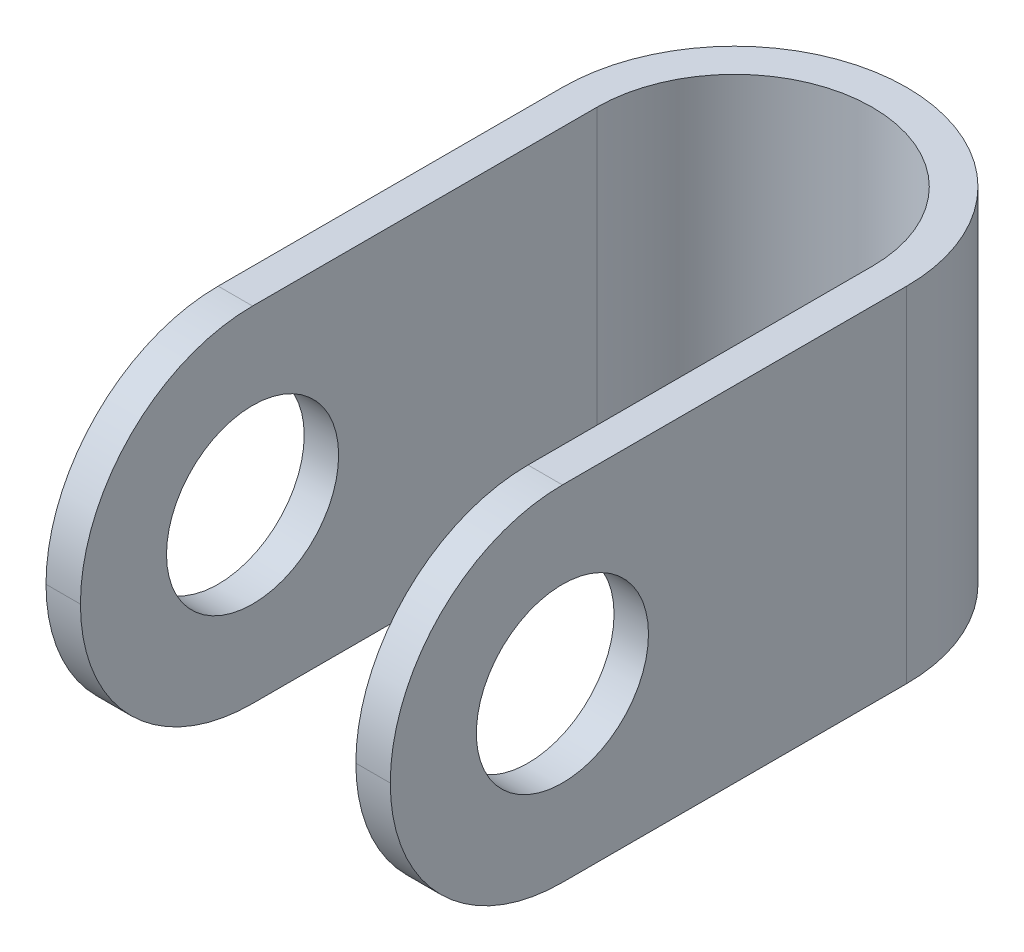
ISO-10303-21;
HEADER;
FILE_DESCRIPTION(('STEP AP214'),'2;1');
FILE_NAME('part.step','',(''),(''),'','','');
FILE_SCHEMA(('AUTOMOTIVE_DESIGN { 1 0 10303 214 1 1 1 1 }'));
ENDSEC;
DATA;
#1=APPLICATION_CONTEXT('core data for automotive mechanical design processes');
#2=APPLICATION_PROTOCOL_DEFINITION('international standard','automotive_design',2000,#1);
#3=PRODUCT_CONTEXT('',#1,'mechanical');
#4=PRODUCT('Part','Part','',(#3));
#5=PRODUCT_RELATED_PRODUCT_CATEGORY('part','',(#4));
#6=PRODUCT_DEFINITION_FORMATION('','',#4);
#7=PRODUCT_DEFINITION_CONTEXT('part definition',#1,'design');
#8=PRODUCT_DEFINITION('design','',#6,#7);
#9=PRODUCT_DEFINITION_SHAPE('','',#8);
#10=(LENGTH_UNIT() NAMED_UNIT(*) SI_UNIT(.MILLI.,.METRE.));
#11=(NAMED_UNIT(*) PLANE_ANGLE_UNIT() SI_UNIT($,.RADIAN.));
#12=(NAMED_UNIT(*) SI_UNIT($,.STERADIAN.) SOLID_ANGLE_UNIT());
#13=UNCERTAINTY_MEASURE_WITH_UNIT(LENGTH_MEASURE(1.E-05),#10,'distance_accuracy_value','');
#14=(GEOMETRIC_REPRESENTATION_CONTEXT(3) GLOBAL_UNCERTAINTY_ASSIGNED_CONTEXT((#13)) GLOBAL_UNIT_ASSIGNED_CONTEXT((#10,
#11,#12)) REPRESENTATION_CONTEXT('',''));
#15=CARTESIAN_POINT('',(0.,0.,0.));
#16=DIRECTION('',(0.,0.,1.));
#17=DIRECTION('',(1.,0.,0.));
#18=AXIS2_PLACEMENT_3D('',#15,#16,#17);
#19=CARTESIAN_POINT('',(0.8,8.,0.));
#20=DIRECTION('',(-1.,0.,0.));
#21=DIRECTION('',(0.,0.,1.));
#22=AXIS2_PLACEMENT_3D('',#19,#20,#21);
#23=PLANE('',#22);
#24=CARTESIAN_POINT('',(0.8,4.,-4.));
#25=DIRECTION('',(1.,0.,0.));
#26=DIRECTION('',(0.,0.,-1.));
#27=AXIS2_PLACEMENT_3D('',#24,#25,#26);
#28=CIRCLE('',#27,2.);
#29=CARTESIAN_POINT('',(0.8,4.,-6.));
#30=VERTEX_POINT('',#29);
#31=EDGE_CURVE('E201',#30,#30,#28,.T.);
#32=ORIENTED_EDGE('',*,*,#31,.F.);
#33=EDGE_LOOP('',(#32));
#34=FACE_BOUND('',#33,.T.);
#35=CARTESIAN_POINT('',(0.799999999999999,4.,-4.));
#36=DIRECTION('',(-1.,0.,0.));
#37=DIRECTION('',(0.,0.,1.));
#38=AXIS2_PLACEMENT_3D('',#35,#36,#37);
#39=CIRCLE('',#38,4.);
#40=CARTESIAN_POINT('',(0.8,8.,-4.));
#41=VERTEX_POINT('',#40);
#42=CARTESIAN_POINT('',(0.8,4.,0.));
#43=VERTEX_POINT('',#42);
#44=EDGE_CURVE('E169',#41,#43,#39,.F.);
#45=ORIENTED_EDGE('',*,*,#44,.T.);
#46=CARTESIAN_POINT('',(0.8,4.,-4.));
#47=DIRECTION('',(-1.,0.,0.));
#48=DIRECTION('',(0.,0.,1.));
#49=AXIS2_PLACEMENT_3D('',#46,#47,#48);
#50=CIRCLE('',#49,4.);
#51=CARTESIAN_POINT('',(0.8,0.,-4.));
#52=VERTEX_POINT('',#51);
#53=EDGE_CURVE('E176',#43,#52,#50,.F.);
#54=ORIENTED_EDGE('',*,*,#53,.T.);
#55=DIRECTION('',(0.,0.,-1.));
#56=VECTOR('',#55,1.);
#57=CARTESIAN_POINT('',(0.8,0.,0.));
#58=LINE('',#57,#56);
#59=CARTESIAN_POINT('',(0.799999999999999,0.,-12.));
#60=VERTEX_POINT('',#59);
#61=EDGE_CURVE('E131',#52,#60,#58,.T.);
#62=ORIENTED_EDGE('',*,*,#61,.T.);
#63=DIRECTION('',(0.,-1.,0.));
#64=VECTOR('',#63,1.);
#65=CARTESIAN_POINT('',(0.799999999999999,8.,-12.));
#66=LINE('',#65,#64);
#67=CARTESIAN_POINT('',(0.799999999999999,8.,-12.));
#68=VERTEX_POINT('',#67);
#69=EDGE_CURVE('E129',#68,#60,#66,.T.);
#70=ORIENTED_EDGE('',*,*,#69,.F.);
#71=DIRECTION('',(0.,0.,-1.));
#72=VECTOR('',#71,1.);
#73=CARTESIAN_POINT('',(0.8,8.,0.));
#74=LINE('',#73,#72);
#75=EDGE_CURVE('E115',#41,#68,#74,.T.);
#76=ORIENTED_EDGE('',*,*,#75,.F.);
#77=EDGE_LOOP('',(#45,#54,#62,#70,#76));
#78=FACE_BOUND('',#77,.T.);
#79=ADVANCED_FACE('F39',(#34,#78),#23,.F.);
#80=CARTESIAN_POINT('',(-3.2,8.,-12.));
#81=DIRECTION('',(0.,-1.,0.));
#82=DIRECTION('',(0.,0.,-1.));
#83=AXIS2_PLACEMENT_3D('',#80,#81,#82);
#84=CYLINDRICAL_SURFACE('',#83,4.);
#85=CARTESIAN_POINT('',(-3.2,0.,-12.));
#86=DIRECTION('',(0.,1.,0.));
#87=DIRECTION('',(0.,0.,-1.));
#88=AXIS2_PLACEMENT_3D('',#85,#86,#87);
#89=CIRCLE('',#88,4.);
#90=CARTESIAN_POINT('',(-7.2,0.,-12.));
#91=VERTEX_POINT('',#90);
#92=EDGE_CURVE('E151',#60,#91,#89,.T.);
#93=ORIENTED_EDGE('',*,*,#92,.T.);
#94=DIRECTION('',(0.,-1.,0.));
#95=VECTOR('',#94,1.);
#96=CARTESIAN_POINT('',(-7.2,8.,-12.));
#97=LINE('',#96,#95);
#98=CARTESIAN_POINT('',(-7.2,8.,-12.));
#99=VERTEX_POINT('',#98);
#100=EDGE_CURVE('E134',#99,#91,#97,.T.);
#101=ORIENTED_EDGE('',*,*,#100,.F.);
#102=CARTESIAN_POINT('',(-3.2,8.,-12.));
#103=DIRECTION('',(0.,1.,0.));
#104=DIRECTION('',(0.,0.,-1.));
#105=AXIS2_PLACEMENT_3D('',#102,#103,#104);
#106=CIRCLE('',#105,4.);
#107=EDGE_CURVE('E119',#68,#99,#106,.T.);
#108=ORIENTED_EDGE('',*,*,#107,.F.);
#109=ORIENTED_EDGE('',*,*,#69,.T.);
#110=EDGE_LOOP('',(#93,#101,#108,#109));
#111=FACE_BOUND('',#110,.T.);
#112=ADVANCED_FACE('F136',(#111),#84,.T.);
#113=CARTESIAN_POINT('',(-7.2,8.,0.));
#114=DIRECTION('',(1.,0.,0.));
#115=DIRECTION('',(0.,0.,-1.));
#116=AXIS2_PLACEMENT_3D('',#113,#114,#115);
#117=PLANE('',#116);
#118=CARTESIAN_POINT('',(-7.2,4.,-4.));
#119=DIRECTION('',(1.,0.,0.));
#120=DIRECTION('',(0.,0.,-1.));
#121=AXIS2_PLACEMENT_3D('',#118,#119,#120);
#122=CIRCLE('',#121,2.);
#123=CARTESIAN_POINT('',(-7.2,4.,-6.));
#124=VERTEX_POINT('',#123);
#125=EDGE_CURVE('E199',#124,#124,#122,.T.);
#126=ORIENTED_EDGE('',*,*,#125,.T.);
#127=EDGE_LOOP('',(#126));
#128=FACE_BOUND('',#127,.T.);
#129=DIRECTION('',(0.,0.,1.));
#130=VECTOR('',#129,1.);
#131=CARTESIAN_POINT('',(-7.2,0.,0.));
#132=LINE('',#131,#130);
#133=CARTESIAN_POINT('',(-7.2,0.,-4.));
#134=VERTEX_POINT('',#133);
#135=EDGE_CURVE('E154',#91,#134,#132,.T.);
#136=ORIENTED_EDGE('',*,*,#135,.T.);
#137=CARTESIAN_POINT('',(-7.2,4.,-4.));
#138=DIRECTION('',(1.,0.,0.));
#139=DIRECTION('',(0.,0.,-1.));
#140=AXIS2_PLACEMENT_3D('',#137,#138,#139);
#141=CIRCLE('',#140,4.);
#142=CARTESIAN_POINT('',(-7.2,4.,0.));
#143=VERTEX_POINT('',#142);
#144=EDGE_CURVE('E48',#134,#143,#141,.F.);
#145=ORIENTED_EDGE('',*,*,#144,.T.);
#146=CARTESIAN_POINT('',(-7.2,4.,-4.));
#147=DIRECTION('',(1.,0.,0.));
#148=DIRECTION('',(0.,0.,-1.));
#149=AXIS2_PLACEMENT_3D('',#146,#147,#148);
#150=CIRCLE('',#149,4.);
#151=CARTESIAN_POINT('',(-7.2,8.,-4.));
#152=VERTEX_POINT('',#151);
#153=EDGE_CURVE('E56',#143,#152,#150,.F.);
#154=ORIENTED_EDGE('',*,*,#153,.T.);
#155=DIRECTION('',(0.,0.,1.));
#156=VECTOR('',#155,1.);
#157=CARTESIAN_POINT('',(-7.2,8.,0.));
#158=LINE('',#157,#156);
#159=EDGE_CURVE('E138',#99,#152,#158,.T.);
#160=ORIENTED_EDGE('',*,*,#159,.F.);
#161=ORIENTED_EDGE('',*,*,#100,.T.);
#162=EDGE_LOOP('',(#136,#145,#154,#160,#161));
#163=FACE_BOUND('',#162,.T.);
#164=ADVANCED_FACE('F207',(#128,#163),#117,.F.);
#165=CARTESIAN_POINT('',(-6.4,8.,0.));
#166=DIRECTION('',(-1.,0.,0.));
#167=DIRECTION('',(0.,0.,1.));
#168=AXIS2_PLACEMENT_3D('',#165,#166,#167);
#169=PLANE('',#168);
#170=CARTESIAN_POINT('',(-6.4,4.,-4.));
#171=DIRECTION('',(-1.,0.,0.));
#172=DIRECTION('',(0.,0.,1.));
#173=AXIS2_PLACEMENT_3D('',#170,#171,#172);
#174=CIRCLE('',#173,2.);
#175=CARTESIAN_POINT('',(-6.4,4.,-2.));
#176=VERTEX_POINT('',#175);
#177=EDGE_CURVE('E191',#176,#176,#174,.T.);
#178=ORIENTED_EDGE('',*,*,#177,.T.);
#179=EDGE_LOOP('',(#178));
#180=FACE_BOUND('',#179,.T.);
#181=CARTESIAN_POINT('',(-6.4,4.,-4.));
#182=DIRECTION('',(-1.,0.,0.));
#183=DIRECTION('',(0.,0.,1.));
#184=AXIS2_PLACEMENT_3D('',#181,#182,#183);
#185=CIRCLE('',#184,4.);
#186=CARTESIAN_POINT('',(-6.4,8.,-4.));
#187=VERTEX_POINT('',#186);
#188=CARTESIAN_POINT('',(-6.4,4.,0.));
#189=VERTEX_POINT('',#188);
#190=EDGE_CURVE('E182',#187,#189,#185,.F.);
#191=ORIENTED_EDGE('',*,*,#190,.T.);
#192=CARTESIAN_POINT('',(-6.4,4.,-4.));
#193=DIRECTION('',(-1.,0.,0.));
#194=DIRECTION('',(0.,0.,1.));
#195=AXIS2_PLACEMENT_3D('',#192,#193,#194);
#196=CIRCLE('',#195,4.);
#197=CARTESIAN_POINT('',(-6.4,0.,-4.));
#198=VERTEX_POINT('',#197);
#199=EDGE_CURVE('E184',#189,#198,#196,.F.);
#200=ORIENTED_EDGE('',*,*,#199,.T.);
#201=DIRECTION('',(0.,0.,-1.));
#202=VECTOR('',#201,1.);
#203=CARTESIAN_POINT('',(-6.4,0.,0.));
#204=LINE('',#203,#202);
#205=CARTESIAN_POINT('',(-6.4,0.,-12.));
#206=VERTEX_POINT('',#205);
#207=EDGE_CURVE('E156',#198,#206,#204,.T.);
#208=ORIENTED_EDGE('',*,*,#207,.T.);
#209=DIRECTION('',(0.,-1.,0.));
#210=VECTOR('',#209,1.);
#211=CARTESIAN_POINT('',(-6.4,8.,-12.));
#212=LINE('',#211,#210);
#213=CARTESIAN_POINT('',(-6.4,8.,-12.));
#214=VERTEX_POINT('',#213);
#215=EDGE_CURVE('E164',#214,#206,#212,.T.);
#216=ORIENTED_EDGE('',*,*,#215,.F.);
#217=DIRECTION('',(0.,0.,-1.));
#218=VECTOR('',#217,1.);
#219=CARTESIAN_POINT('',(-6.4,8.,0.));
#220=LINE('',#219,#218);
#221=EDGE_CURVE('E140',#187,#214,#220,.T.);
#222=ORIENTED_EDGE('',*,*,#221,.F.);
#223=EDGE_LOOP('',(#191,#200,#208,#216,#222));
#224=FACE_BOUND('',#223,.T.);
#225=ADVANCED_FACE('F252',(#180,#224),#169,.F.);
#226=CARTESIAN_POINT('',(-3.2,8.,-12.));
#227=DIRECTION('',(0.,-1.,0.));
#228=DIRECTION('',(0.,0.,-1.));
#229=AXIS2_PLACEMENT_3D('',#226,#227,#228);
#230=CYLINDRICAL_SURFACE('',#229,3.2);
#231=CARTESIAN_POINT('',(-3.2,0.,-12.));
#232=DIRECTION('',(0.,-1.,0.));
#233=DIRECTION('',(0.,0.,-1.));
#234=AXIS2_PLACEMENT_3D('',#231,#232,#233);
#235=CIRCLE('',#234,3.2);
#236=CARTESIAN_POINT('',(0.,0.,-12.));
#237=VERTEX_POINT('',#236);
#238=EDGE_CURVE('E158',#206,#237,#235,.T.);
#239=ORIENTED_EDGE('',*,*,#238,.T.);
#240=DIRECTION('',(0.,-1.,0.));
#241=VECTOR('',#240,1.);
#242=CARTESIAN_POINT('',(0.,8.,-12.));
#243=LINE('',#242,#241);
#244=CARTESIAN_POINT('',(0.,8.,-12.));
#245=VERTEX_POINT('',#244);
#246=EDGE_CURVE('E149',#245,#237,#243,.T.);
#247=ORIENTED_EDGE('',*,*,#246,.F.);
#248=CARTESIAN_POINT('',(-3.2,8.,-12.));
#249=DIRECTION('',(0.,-1.,0.));
#250=DIRECTION('',(0.,0.,-1.));
#251=AXIS2_PLACEMENT_3D('',#248,#249,#250);
#252=CIRCLE('',#251,3.2);
#253=EDGE_CURVE('E145',#214,#245,#252,.T.);
#254=ORIENTED_EDGE('',*,*,#253,.F.);
#255=ORIENTED_EDGE('',*,*,#215,.T.);
#256=EDGE_LOOP('',(#239,#247,#254,#255));
#257=FACE_BOUND('',#256,.T.);
#258=ADVANCED_FACE('F258',(#257),#230,.F.);
#259=CARTESIAN_POINT('',(0.,8.,0.));
#260=DIRECTION('',(1.,0.,0.));
#261=DIRECTION('',(0.,0.,-1.));
#262=AXIS2_PLACEMENT_3D('',#259,#260,#261);
#263=PLANE('',#262);
#264=CARTESIAN_POINT('',(0.,4.,-4.));
#265=DIRECTION('',(1.,0.,0.));
#266=DIRECTION('',(0.,0.,-1.));
#267=AXIS2_PLACEMENT_3D('',#264,#265,#266);
#268=CIRCLE('',#267,2.);
#269=CARTESIAN_POINT('',(0.,4.,-6.));
#270=VERTEX_POINT('',#269);
#271=EDGE_CURVE('E43',#270,#270,#268,.T.);
#272=ORIENTED_EDGE('',*,*,#271,.T.);
#273=EDGE_LOOP('',(#272));
#274=FACE_BOUND('',#273,.T.);
#275=DIRECTION('',(0.,0.,1.));
#276=VECTOR('',#275,1.);
#277=CARTESIAN_POINT('',(0.,0.,0.));
#278=LINE('',#277,#276);
#279=CARTESIAN_POINT('',(0.,0.,-4.));
#280=VERTEX_POINT('',#279);
#281=EDGE_CURVE('E126',#237,#280,#278,.T.);
#282=ORIENTED_EDGE('',*,*,#281,.T.);
#283=CARTESIAN_POINT('',(0.,4.,-4.));
#284=DIRECTION('',(1.,0.,0.));
#285=DIRECTION('',(0.,0.,-1.));
#286=AXIS2_PLACEMENT_3D('',#283,#284,#285);
#287=CIRCLE('',#286,4.);
#288=CARTESIAN_POINT('',(0.,4.,0.));
#289=VERTEX_POINT('',#288);
#290=EDGE_CURVE('E180',#280,#289,#287,.F.);
#291=ORIENTED_EDGE('',*,*,#290,.T.);
#292=CARTESIAN_POINT('',(0.,4.,-4.));
#293=DIRECTION('',(1.,0.,0.));
#294=DIRECTION('',(0.,0.,-1.));
#295=AXIS2_PLACEMENT_3D('',#292,#293,#294);
#296=CIRCLE('',#295,4.);
#297=CARTESIAN_POINT('',(0.,8.,-4.));
#298=VERTEX_POINT('',#297);
#299=EDGE_CURVE('E174',#289,#298,#296,.F.);
#300=ORIENTED_EDGE('',*,*,#299,.T.);
#301=DIRECTION('',(0.,0.,1.));
#302=VECTOR('',#301,1.);
#303=CARTESIAN_POINT('',(0.,8.,0.));
#304=LINE('',#303,#302);
#305=EDGE_CURVE('E147',#245,#298,#304,.T.);
#306=ORIENTED_EDGE('',*,*,#305,.F.);
#307=ORIENTED_EDGE('',*,*,#246,.T.);
#308=EDGE_LOOP('',(#282,#291,#300,#306,#307));
#309=FACE_BOUND('',#308,.T.);
#310=ADVANCED_FACE('F261',(#274,#309),#263,.F.);
#311=CARTESIAN_POINT('',(-3.2,8.,-12.));
#312=DIRECTION('',(0.,-1.,0.));
#313=DIRECTION('',(0.,0.,-1.));
#314=AXIS2_PLACEMENT_3D('',#311,#312,#313);
#315=PLANE('',#314);
#316=ORIENTED_EDGE('',*,*,#159,.T.);
#317=DIRECTION('',(1.,0.,0.));
#318=VECTOR('',#317,1.);
#319=CARTESIAN_POINT('',(-3.2,8.,-4.));
#320=LINE('',#319,#318);
#321=EDGE_CURVE('E11',#152,#187,#320,.T.);
#322=ORIENTED_EDGE('',*,*,#321,.T.);
#323=ORIENTED_EDGE('',*,*,#221,.T.);
#324=ORIENTED_EDGE('',*,*,#253,.T.);
#325=ORIENTED_EDGE('',*,*,#305,.T.);
#326=DIRECTION('',(1.,0.,0.));
#327=VECTOR('',#326,1.);
#328=CARTESIAN_POINT('',(-3.2,8.,-4.));
#329=LINE('',#328,#327);
#330=EDGE_CURVE('E123',#298,#41,#329,.T.);
#331=ORIENTED_EDGE('',*,*,#330,.T.);
#332=ORIENTED_EDGE('',*,*,#75,.T.);
#333=ORIENTED_EDGE('',*,*,#107,.T.);
#334=EDGE_LOOP('',(#316,#322,#323,#324,#325,#331,#332,#333));
#335=FACE_BOUND('',#334,.T.);
#336=ADVANCED_FACE('F117',(#335),#315,.F.);
#337=CARTESIAN_POINT('',(-3.2,0.,-12.));
#338=DIRECTION('',(0.,-1.,0.));
#339=DIRECTION('',(0.,0.,-1.));
#340=AXIS2_PLACEMENT_3D('',#337,#338,#339);
#341=PLANE('',#340);
#342=ORIENTED_EDGE('',*,*,#207,.F.);
#343=DIRECTION('',(1.,0.,0.));
#344=VECTOR('',#343,1.);
#345=CARTESIAN_POINT('',(-7.2,0.,-4.));
#346=LINE('',#345,#344);
#347=EDGE_CURVE('E186',#198,#134,#346,.F.);
#348=ORIENTED_EDGE('',*,*,#347,.T.);
#349=ORIENTED_EDGE('',*,*,#135,.F.);
#350=ORIENTED_EDGE('',*,*,#92,.F.);
#351=ORIENTED_EDGE('',*,*,#61,.F.);
#352=DIRECTION('',(1.,0.,0.));
#353=VECTOR('',#352,1.);
#354=CARTESIAN_POINT('',(0.,0.,-4.));
#355=LINE('',#354,#353);
#356=EDGE_CURVE('E178',#52,#280,#355,.F.);
#357=ORIENTED_EDGE('',*,*,#356,.T.);
#358=ORIENTED_EDGE('',*,*,#281,.F.);
#359=ORIENTED_EDGE('',*,*,#238,.F.);
#360=EDGE_LOOP('',(#342,#348,#349,#350,#351,#357,#358,#359));
#361=FACE_BOUND('',#360,.T.);
#362=ADVANCED_FACE('F234',(#361),#341,.T.);
#363=CARTESIAN_POINT('',(-3.2,4.,-4.));
#364=DIRECTION('',(1.,0.,0.));
#365=DIRECTION('',(0.,0.,-1.));
#366=AXIS2_PLACEMENT_3D('',#363,#364,#365);
#367=CYLINDRICAL_SURFACE('',#366,4.);
#368=ORIENTED_EDGE('',*,*,#299,.F.);
#369=DIRECTION('',(1.,0.,0.));
#370=VECTOR('',#369,1.);
#371=CARTESIAN_POINT('',(0.,4.,0.));
#372=LINE('',#371,#370);
#373=EDGE_CURVE('E171',#43,#289,#372,.F.);
#374=ORIENTED_EDGE('',*,*,#373,.F.);
#375=ORIENTED_EDGE('',*,*,#44,.F.);
#376=ORIENTED_EDGE('',*,*,#330,.F.);
#377=EDGE_LOOP('',(#368,#374,#375,#376));
#378=FACE_BOUND('',#377,.T.);
#379=ADVANCED_FACE('F230',(#378),#367,.T.);
#380=CARTESIAN_POINT('',(0.,4.,-4.));
#381=DIRECTION('',(-1.,0.,0.));
#382=DIRECTION('',(0.,0.,1.));
#383=AXIS2_PLACEMENT_3D('',#380,#381,#382);
#384=CYLINDRICAL_SURFACE('',#383,4.);
#385=ORIENTED_EDGE('',*,*,#290,.F.);
#386=ORIENTED_EDGE('',*,*,#356,.F.);
#387=ORIENTED_EDGE('',*,*,#53,.F.);
#388=ORIENTED_EDGE('',*,*,#373,.T.);
#389=EDGE_LOOP('',(#385,#386,#387,#388));
#390=FACE_BOUND('',#389,.T.);
#391=ADVANCED_FACE('F233',(#390),#384,.T.);
#392=CARTESIAN_POINT('',(-3.2,4.,-4.));
#393=DIRECTION('',(1.,0.,0.));
#394=DIRECTION('',(0.,0.,-1.));
#395=AXIS2_PLACEMENT_3D('',#392,#393,#394);
#396=CYLINDRICAL_SURFACE('',#395,4.);
#397=ORIENTED_EDGE('',*,*,#321,.F.);
#398=ORIENTED_EDGE('',*,*,#153,.F.);
#399=DIRECTION('',(1.,0.,0.));
#400=VECTOR('',#399,1.);
#401=CARTESIAN_POINT('',(-6.4,4.,0.));
#402=LINE('',#401,#400);
#403=EDGE_CURVE('E152',#189,#143,#402,.F.);
#404=ORIENTED_EDGE('',*,*,#403,.F.);
#405=ORIENTED_EDGE('',*,*,#190,.F.);
#406=EDGE_LOOP('',(#397,#398,#404,#405));
#407=FACE_BOUND('',#406,.T.);
#408=ADVANCED_FACE('F41',(#407),#396,.T.);
#409=CARTESIAN_POINT('',(-6.4,4.,-4.));
#410=DIRECTION('',(-1.,0.,0.));
#411=DIRECTION('',(0.,0.,1.));
#412=AXIS2_PLACEMENT_3D('',#409,#410,#411);
#413=CYLINDRICAL_SURFACE('',#412,4.);
#414=ORIENTED_EDGE('',*,*,#144,.F.);
#415=ORIENTED_EDGE('',*,*,#347,.F.);
#416=ORIENTED_EDGE('',*,*,#199,.F.);
#417=ORIENTED_EDGE('',*,*,#403,.T.);
#418=EDGE_LOOP('',(#414,#415,#416,#417));
#419=FACE_BOUND('',#418,.T.);
#420=ADVANCED_FACE('F217',(#419),#413,.T.);
#421=CARTESIAN_POINT('',(-7.2,4.,-4.));
#422=DIRECTION('',(1.,0.,0.));
#423=DIRECTION('',(0.,0.,-1.));
#424=AXIS2_PLACEMENT_3D('',#421,#422,#423);
#425=CYLINDRICAL_SURFACE('',#424,2.);
#426=ORIENTED_EDGE('',*,*,#31,.T.);
#427=EDGE_LOOP('',(#426));
#428=FACE_BOUND('',#427,.T.);
#429=ORIENTED_EDGE('',*,*,#271,.F.);
#430=EDGE_LOOP('',(#429));
#431=FACE_BOUND('',#430,.T.);
#432=ADVANCED_FACE('F212',(#428,#431),#425,.F.);
#433=ORIENTED_EDGE('',*,*,#125,.F.);
#434=EDGE_LOOP('',(#433));
#435=FACE_BOUND('',#434,.T.);
#436=ORIENTED_EDGE('',*,*,#177,.F.);
#437=EDGE_LOOP('',(#436));
#438=FACE_BOUND('',#437,.T.);
#439=ADVANCED_FACE('F209',(#435,#438),#425,.F.);
#440=CLOSED_SHELL('',(#79,#112,#164,#225,#258,#310,#336,#362,#379,#391,#408,#420,#432,#439));
#441=MANIFOLD_SOLID_BREP('B2',#440);
#442=ADVANCED_BREP_SHAPE_REPRESENTATION('',(#18,#441),#14);
#443=SHAPE_DEFINITION_REPRESENTATION(#9,#442);
ENDSEC;
END-ISO-10303-21;
